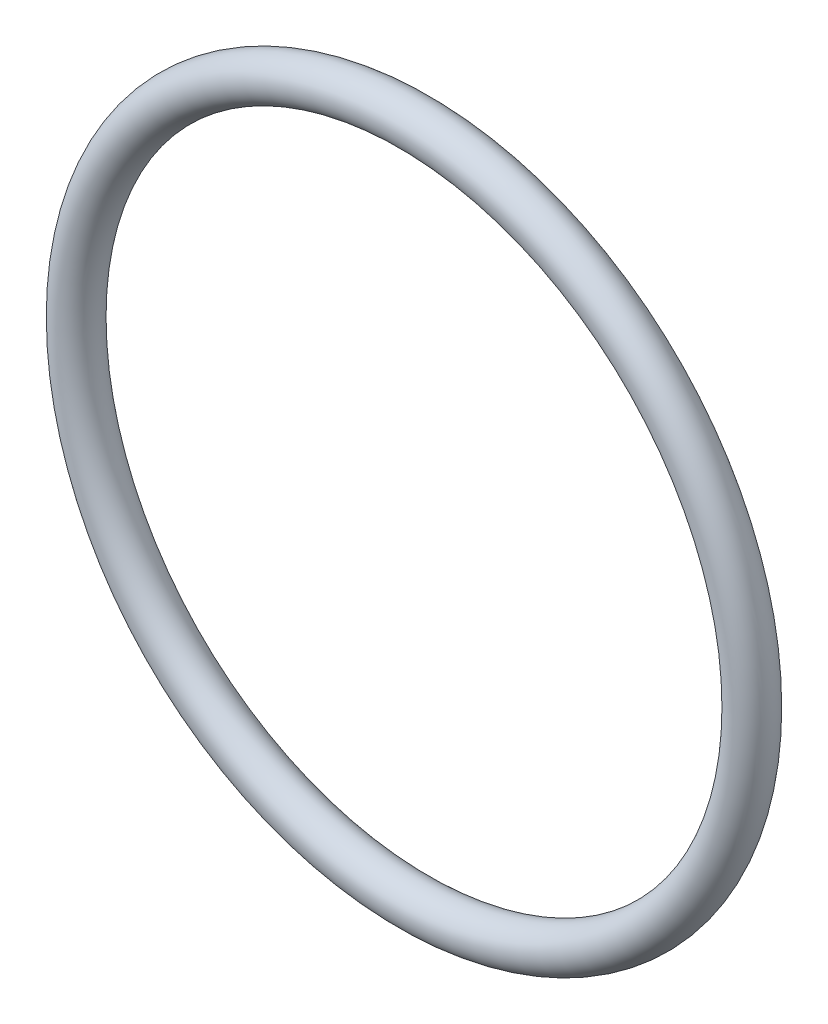
ISO-10303-21;
HEADER;
FILE_DESCRIPTION(('STEP AP214'),'2;1');
FILE_NAME('part.step','',(''),(''),'','','');
FILE_SCHEMA(('AUTOMOTIVE_DESIGN { 1 0 10303 214 1 1 1 1 }'));
ENDSEC;
DATA;
#1=APPLICATION_CONTEXT('core data for automotive mechanical design processes');
#2=APPLICATION_PROTOCOL_DEFINITION('international standard','automotive_design',2000,#1);
#3=PRODUCT_CONTEXT('',#1,'mechanical');
#4=PRODUCT('Part','Part','',(#3));
#5=PRODUCT_RELATED_PRODUCT_CATEGORY('part','',(#4));
#6=PRODUCT_DEFINITION_FORMATION('','',#4);
#7=PRODUCT_DEFINITION_CONTEXT('part definition',#1,'design');
#8=PRODUCT_DEFINITION('design','',#6,#7);
#9=PRODUCT_DEFINITION_SHAPE('','',#8);
#10=(LENGTH_UNIT() NAMED_UNIT(*) SI_UNIT(.MILLI.,.METRE.));
#11=(NAMED_UNIT(*) PLANE_ANGLE_UNIT() SI_UNIT($,.RADIAN.));
#12=(NAMED_UNIT(*) SI_UNIT($,.STERADIAN.) SOLID_ANGLE_UNIT());
#13=UNCERTAINTY_MEASURE_WITH_UNIT(LENGTH_MEASURE(1.E-05),#10,'distance_accuracy_value','');
#14=(GEOMETRIC_REPRESENTATION_CONTEXT(3) GLOBAL_UNCERTAINTY_ASSIGNED_CONTEXT((#13)) GLOBAL_UNIT_ASSIGNED_CONTEXT((#10,
#11,#12)) REPRESENTATION_CONTEXT('',''));
#15=CARTESIAN_POINT('',(0.,0.,0.));
#16=DIRECTION('',(0.,0.,1.));
#17=DIRECTION('',(1.,0.,0.));
#18=AXIS2_PLACEMENT_3D('',#15,#16,#17);
#19=CARTESIAN_POINT('',(0.,0.,0.));
#20=DIRECTION('',(0.,0.,1.));
#21=DIRECTION('',(1.,0.,0.));
#22=AXIS2_PLACEMENT_3D('',#19,#20,#21);
#23=TOROIDAL_SURFACE('',#22,19.0220527726707,1.190625);
#24=CARTESIAN_POINT('',(20.2126777726707,0.,0.));
#25=VERTEX_POINT('',#24);
#26=VERTEX_LOOP('',#25);
#27=FACE_BOUND('',#26,.T.);
#28=ADVANCED_FACE('F38',(#27),#23,.T.);
#29=CLOSED_SHELL('',(#28));
#30=MANIFOLD_SOLID_BREP('B2',#29);
#31=ADVANCED_BREP_SHAPE_REPRESENTATION('',(#18,#30),#14);
#32=SHAPE_DEFINITION_REPRESENTATION(#9,#31);
ENDSEC;
END-ISO-10303-21;
